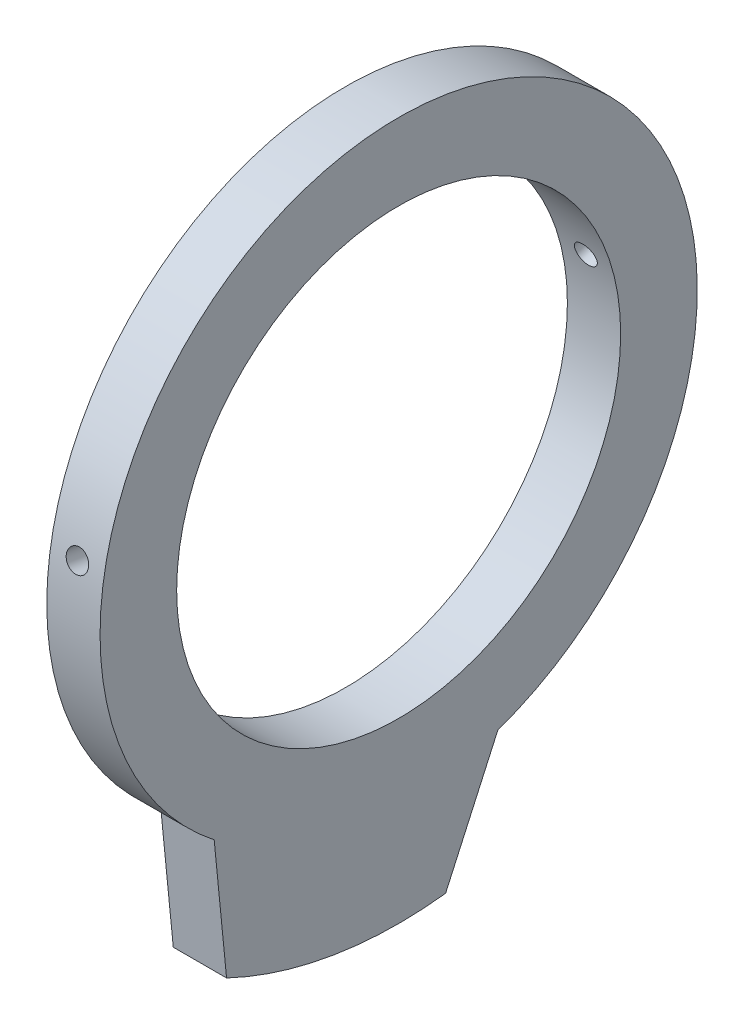
ISO-10303-21;
HEADER;
FILE_DESCRIPTION(('STEP AP214'),'2;1');
FILE_NAME('part.step','',(''),(''),'','','');
FILE_SCHEMA(('AUTOMOTIVE_DESIGN { 1 0 10303 214 1 1 1 1 }'));
ENDSEC;
DATA;
#1=APPLICATION_CONTEXT('core data for automotive mechanical design processes');
#2=APPLICATION_PROTOCOL_DEFINITION('international standard','automotive_design',2000,#1);
#3=PRODUCT_CONTEXT('',#1,'mechanical');
#4=PRODUCT('Part','Part','',(#3));
#5=PRODUCT_RELATED_PRODUCT_CATEGORY('part','',(#4));
#6=PRODUCT_DEFINITION_FORMATION('','',#4);
#7=PRODUCT_DEFINITION_CONTEXT('part definition',#1,'design');
#8=PRODUCT_DEFINITION('design','',#6,#7);
#9=PRODUCT_DEFINITION_SHAPE('','',#8);
#10=(LENGTH_UNIT() NAMED_UNIT(*) SI_UNIT(.MILLI.,.METRE.));
#11=(NAMED_UNIT(*) PLANE_ANGLE_UNIT() SI_UNIT($,.RADIAN.));
#12=(NAMED_UNIT(*) SI_UNIT($,.STERADIAN.) SOLID_ANGLE_UNIT());
#13=UNCERTAINTY_MEASURE_WITH_UNIT(LENGTH_MEASURE(1.E-05),#10,'distance_accuracy_value','');
#14=(GEOMETRIC_REPRESENTATION_CONTEXT(3) GLOBAL_UNCERTAINTY_ASSIGNED_CONTEXT((#13)) GLOBAL_UNIT_ASSIGNED_CONTEXT((#10,
#11,#12)) REPRESENTATION_CONTEXT('',''));
#15=CARTESIAN_POINT('',(0.,0.,0.));
#16=DIRECTION('',(0.,0.,1.));
#17=DIRECTION('',(1.,0.,0.));
#18=AXIS2_PLACEMENT_3D('',#15,#16,#17);
#19=CARTESIAN_POINT('',(12.,0.,0.));
#20=DIRECTION('',(-1.,0.,0.));
#21=DIRECTION('',(0.,0.,1.));
#22=AXIS2_PLACEMENT_3D('',#19,#20,#21);
#23=CYLINDRICAL_SURFACE('',#22,67.25);
#24=DIRECTION('',(-1.,0.,0.));
#25=VECTOR('',#24,1.);
#26=CARTESIAN_POINT('',(12.,-52.8792142824339,41.5493826292574));
#27=LINE('',#26,#25);
#28=CARTESIAN_POINT('',(12.,-52.8792142824339,41.5493826292574));
#29=VERTEX_POINT('',#28);
#30=CARTESIAN_POINT('',(0.,-52.8792142824339,41.5493826292574));
#31=VERTEX_POINT('',#30);
#32=EDGE_CURVE('E64',#29,#31,#27,.T.);
#33=ORIENTED_EDGE('',*,*,#32,.F.);
#34=CARTESIAN_POINT('',(12.,0.,0.));
#35=DIRECTION('',(1.,0.,0.));
#36=DIRECTION('',(0.,0.,-1.));
#37=AXIS2_PLACEMENT_3D('',#34,#35,#36);
#38=CIRCLE('',#37,67.25);
#39=CARTESIAN_POINT('',(12.,-63.4350909638531,-22.3282720873714));
#40=VERTEX_POINT('',#39);
#41=EDGE_CURVE('E11',#40,#29,#38,.T.);
#42=ORIENTED_EDGE('',*,*,#41,.F.);
#43=DIRECTION('',(-1.,0.,0.));
#44=VECTOR('',#43,1.);
#45=CARTESIAN_POINT('',(12.,-63.435090963853,-22.3282720873714));
#46=LINE('',#45,#44);
#47=CARTESIAN_POINT('',(0.,-63.435090963853,-22.3282720873714));
#48=VERTEX_POINT('',#47);
#49=EDGE_CURVE('E106',#40,#48,#46,.T.);
#50=ORIENTED_EDGE('',*,*,#49,.T.);
#51=CARTESIAN_POINT('',(0.,0.,0.));
#52=DIRECTION('',(1.,0.,0.));
#53=DIRECTION('',(0.,0.,-1.));
#54=AXIS2_PLACEMENT_3D('',#51,#52,#53);
#55=CIRCLE('',#54,67.25);
#56=EDGE_CURVE('E53',#48,#31,#55,.T.);
#57=ORIENTED_EDGE('',*,*,#56,.T.);
#58=EDGE_LOOP('',(#33,#42,#50,#57));
#59=FACE_BOUND('',#58,.T.);
#60=CARTESIAN_POINT('',(6.,13.4103499452431,65.8993551891528));
#61=CARTESIAN_POINT('',(5.85962596684936,13.410343921143,65.8993568182794));
#62=CARTESIAN_POINT('',(5.71915138417467,13.3987180678698,65.9017255594599));
#63=CARTESIAN_POINT('',(5.44207453378758,13.3524975738546,65.9111056134821));
#64=CARTESIAN_POINT('',(5.30547707444028,13.31787560917,65.9181224491555));
#65=CARTESIAN_POINT('',(5.04020848672856,13.2266352500863,65.9364904517764));
#66=CARTESIAN_POINT('',(4.91153346816741,13.1700277527785,65.9478394714366));
#67=CARTESIAN_POINT('',(4.66573141835666,13.036412016286,65.9743819874361));
#68=CARTESIAN_POINT('',(4.54860160557546,12.9594087075327,65.9895745546062));
#69=CARTESIAN_POINT('',(4.32910611098146,12.7870986184499,66.0231799825619));
#70=CARTESIAN_POINT('',(4.22674838246953,12.6917820421473,66.0415945663675));
#71=CARTESIAN_POINT('',(4.03976995925546,12.4855329511549,66.0808971212534));
#72=CARTESIAN_POINT('',(3.95514997617556,12.3745998102411,66.1017851915152));
#73=CARTESIAN_POINT('',(3.80603206393874,12.1401968005381,66.1452365031962));
#74=CARTESIAN_POINT('',(3.74153959555264,12.0167235415274,66.1678001971749));
#75=CARTESIAN_POINT('',(3.63454268673079,11.7607393906702,66.2137780397988));
#76=CARTESIAN_POINT('',(3.59203813459913,11.6282285447375,66.2371921841232));
#77=CARTESIAN_POINT('',(3.53024260001181,11.3579752633211,66.2840681272246));
#78=CARTESIAN_POINT('',(3.51094080233302,11.2202352961349,66.3075298986892));
#79=CARTESIAN_POINT('',(3.49606533820189,10.9433694127409,66.3537855866805));
#80=CARTESIAN_POINT('',(3.50049154933577,10.8042435036869,66.3765795066521));
#81=CARTESIAN_POINT('',(3.53293740149765,10.5286296092104,66.4208546731847));
#82=CARTESIAN_POINT('',(3.56094538440454,10.3921403544055,66.4423365627471));
#83=CARTESIAN_POINT('',(3.63974168616613,10.1256151405055,66.4834762406865));
#84=CARTESIAN_POINT('',(3.69053006886652,9.99557919949786,66.5031340239508));
#85=CARTESIAN_POINT('',(3.81345882697479,9.74563912678506,66.5402209360187));
#86=CARTESIAN_POINT('',(3.88560453591791,9.62573753554327,66.5576495065652));
#87=CARTESIAN_POINT('',(4.04919606179541,9.3995297669126,66.5899723425698));
#88=CARTESIAN_POINT('',(4.14064195062264,9.29322364016897,66.6048665985872));
#89=CARTESIAN_POINT('',(4.34030398385878,9.09719298450711,66.6319247782819));
#90=CARTESIAN_POINT('',(4.44853024216618,9.00747852773577,66.6440870444311));
#91=CARTESIAN_POINT('',(4.67864524147305,8.84729153214643,66.6655419631115));
#92=CARTESIAN_POINT('',(4.80053398506279,8.77681899697652,66.6748346150984));
#93=CARTESIAN_POINT('',(5.05451984979324,8.65714905306906,66.6904785590197));
#94=CARTESIAN_POINT('',(5.18661713585782,8.60795198813161,66.6968298034226));
#95=CARTESIAN_POINT('',(5.45726766953744,8.53226010230363,66.7065551968214));
#96=CARTESIAN_POINT('',(5.59582089024709,8.50576518680983,66.7099293582233));
#97=CARTESIAN_POINT('',(5.875361428989,8.47625571469535,66.7136853660637));
#98=CARTESIAN_POINT('',(6.01634724032873,8.47322711226874,66.7140690024875));
#99=CARTESIAN_POINT('',(6.29682893177522,8.49070119433891,66.7118472823151));
#100=CARTESIAN_POINT('',(6.43632481457059,8.51120383636555,66.7092419311136));
#101=CARTESIAN_POINT('',(6.70982730727681,8.57513621726688,66.7010537119806));
#102=CARTESIAN_POINT('',(6.84383543694115,8.61855956168,66.6954716744864));
#103=CARTESIAN_POINT('',(7.1026051330937,8.72707276875061,66.6813592935752));
#104=CARTESIAN_POINT('',(7.22736667041993,8.79216269973685,66.6728289408603));
#105=CARTESIAN_POINT('',(7.46416681211201,8.94216757861968,66.6528757434156));
#106=CARTESIAN_POINT('',(7.57619933037553,9.0270919511209,66.6414515234065));
#107=CARTESIAN_POINT('',(7.7843000809794,9.21430601667161,66.6158237008624));
#108=CARTESIAN_POINT('',(7.88036825414616,9.31659577408497,66.6016200880256));
#109=CARTESIAN_POINT('',(8.05386061579873,9.53566076915401,66.5706083352009));
#110=CARTESIAN_POINT('',(8.1312756758376,9.65244305697213,66.5537989265762));
#111=CARTESIAN_POINT('',(8.26520188617609,9.8971085163194,66.5178548291732));
#112=CARTESIAN_POINT('',(8.32171309686356,10.0249916557787,66.4987201471125));
#113=CARTESIAN_POINT('',(8.41221145555391,10.2881680619751,66.4585118573554));
#114=CARTESIAN_POINT('',(8.44620449453793,10.4234593806226,66.4374387584128));
#115=CARTESIAN_POINT('',(8.49072088023663,10.6976227179673,66.3938447970263));
#116=CARTESIAN_POINT('',(8.50124428117829,10.8364947283905,66.3713239379276));
#117=CARTESIAN_POINT('',(8.49852200901685,11.113782217989,66.3254557591832));
#118=CARTESIAN_POINT('',(8.48529069165981,11.2521979222836,66.3021089470457));
#119=CARTESIAN_POINT('',(8.43546415576133,11.5247346101806,66.2552799243878));
#120=CARTESIAN_POINT('',(8.39886889152243,11.6588555853824,66.2317977136027));
#121=CARTESIAN_POINT('',(8.30335572396551,11.9190180318254,66.1854741042815));
#122=CARTESIAN_POINT('',(8.24443749297158,12.045059384435,66.1626327151573));
#123=CARTESIAN_POINT('',(8.1059544828971,12.2855130231588,66.1184061616525));
#124=CARTESIAN_POINT('',(8.0263904163695,12.3999257104254,66.0970209470468));
#125=CARTESIAN_POINT('',(7.84882700631855,12.6139760393559,66.0565061314169));
#126=CARTESIAN_POINT('',(7.75081851631012,12.7136063064745,66.037377657187));
#127=CARTESIAN_POINT('',(7.53913826884652,12.8952603323604,66.0021465372339));
#128=CARTESIAN_POINT('',(7.42546264649562,12.977279733926,65.9860446404555));
#129=CARTESIAN_POINT('',(7.18561705687761,13.1214397606013,65.9575298176285));
#130=CARTESIAN_POINT('',(7.05943789041893,13.1835656051492,65.9451196349423));
#131=CARTESIAN_POINT('',(6.79832859520822,13.286060976545,65.9245465841147));
#132=CARTESIAN_POINT('',(6.6634090872376,13.3264563733602,65.9163786659845));
#133=CARTESIAN_POINT('',(6.43970122508831,13.3736927891832,65.9068066439632));
#134=CARTESIAN_POINT('',(6.35236403355643,13.3874221116735,65.9040174658687));
#135=CARTESIAN_POINT('',(6.17669784366073,13.4057525837661,65.9002912261015));
#136=CARTESIAN_POINT('',(6.08836884575234,13.4103537375597,65.8993541635782));
#137=CARTESIAN_POINT('',(6.,13.4103499452431,65.8993551891528));
#138=B_SPLINE_CURVE_WITH_KNOTS('',3,(#60,#61,#62,#63,#64,#65,#66,#67,#68,#69,#70,#71,#72,#73,
#74,#75,#76,#77,#78,#79,#80,#81,#82,#83,#84,#85,#86,#87,#88,#89,#90,#91,#92,#93,#94,#95,#96,#97,
#98,#99,#100,#101,#102,#103,#104,#105,#106,#107,#108,#109,#110,#111,#112,#113,#114,#115,#116,
#117,#118,#119,#120,#121,#122,#123,#124,#125,#126,#127,#128,#129,#130,#131,#132,#133,#134,#135,
#136,#137),.UNSPECIFIED.,.T.,.F.,(4,2,2,2,2,2,2,2,2,2,2,2,2,2,2,2,2,2,2,2,2,2,2,2,2,2,2,2,2,2,2,
2,2,2,2,2,2,2,4),(0.,0.420799534941201,0.842099959795231,1.26319183376372,1.68418200681227,
2.10539800237828,2.52663089351446,2.94797796966803,3.36932290540929,3.79047136841455,
4.21161765869935,4.63255586904702,5.0534952591483,5.47453985866155,5.89558602658648,
6.31688696195,6.73818797718827,7.15949580016905,7.58080186748813,8.00185574177114,
8.42290885612036,8.84384456629946,9.26478160397328,9.6859190640005,10.107058084985,
10.5284027859795,10.9497462697673,11.3709794822672,11.7922117214999,12.2131894821236,
12.6341680661387,13.0551528298827,13.4761230660459,13.8973026116886,14.3185862439213,
14.7401821600854,15.1612750518206,15.426178648559,15.6910821236623),.UNSPECIFIED.);
#139=CARTESIAN_POINT('',(6.,13.4103499452431,65.8993551891528));
#140=VERTEX_POINT('',#139);
#141=EDGE_CURVE('E128',#140,#140,#138,.T.);
#142=ORIENTED_EDGE('',*,*,#141,.F.);
#143=EDGE_LOOP('',(#142));
#144=FACE_BOUND('',#143,.T.);
#145=CARTESIAN_POINT('',(6.,15.6829256297998,-65.3957823081135));
#146=CARTESIAN_POINT('',(5.85962596684936,15.682931778207,-65.3957812399726));
#147=CARTESIAN_POINT('',(5.71915138417467,15.6944700212037,-65.3930171220917));
#148=CARTESIAN_POINT('',(5.44207453378758,15.7403264635433,-65.3819941380842));
#149=CARTESIAN_POINT('',(5.30547707444028,15.7746717621817,-65.3737287353155));
#150=CARTESIAN_POINT('',(5.04020848672857,15.8651307653616,-65.3518345491081));
#151=CARTESIAN_POINT('',(4.91153346816742,15.9212336857554,-65.3382084226595));
#152=CARTESIAN_POINT('',(4.66573141835666,16.0535546793141,-65.3058228570836));
#153=CARTESIAN_POINT('',(4.54860160557547,16.1297678910516,-65.2870646585341));
#154=CARTESIAN_POINT('',(4.32910611098147,16.3001448378741,-65.2447351466159));
#155=CARTESIAN_POINT('',(4.22674838246953,16.3943181798353,-65.2211612568509));
#156=CARTESIAN_POINT('',(4.03976995925547,16.5978639043325,-65.16965867056));
#157=CARTESIAN_POINT('',(3.95514997617556,16.7072368963721,-65.1417297993946));
#158=CARTESIAN_POINT('',(3.80603206393874,16.9380537491411,-65.0820945084803));
#159=CARTESIAN_POINT('',(3.74153959555264,17.0595008739247,-65.0503870667909));
#160=CARTESIAN_POINT('',(3.63454268673079,17.3109460446101,-64.9839252458606));
#161=CARTESIAN_POINT('',(3.59203813459913,17.4409440470707,-64.9491708820988));
#162=CARTESIAN_POINT('',(3.53024260001181,17.7057020674337,-64.8774953576048));
#163=CARTESIAN_POINT('',(3.51094080233301,17.8404598365468,-64.8405752148048));
#164=CARTESIAN_POINT('',(3.49606533820189,18.1109494682431,-64.7655441198916));
#165=CARTESIAN_POINT('',(3.50049154933577,18.2466813257975,-64.7274331739229));
#166=CARTESIAN_POINT('',(3.53293740149764,18.515199525869,-64.6511358251464));
#167=CARTESIAN_POINT('',(3.56094538440453,18.6479872905719,-64.6129494689238));
#168=CARTESIAN_POINT('',(3.63974168616612,18.9069430287309,-64.5376494794154));
#169=CARTESIAN_POINT('',(3.69053006886652,19.0331109836327,-64.5005358491363));
#170=CARTESIAN_POINT('',(3.81345882697479,19.2753220209821,-64.4285685483633));
#171=CARTESIAN_POINT('',(3.8856045359179,19.3913625649416,-64.3937154450411));
#172=CARTESIAN_POINT('',(4.0491960617954,19.6100502712417,-64.3274552954075));
#173=CARTESIAN_POINT('',(4.14064195062264,19.7126973836896,-64.2960482619334));
#174=CARTESIAN_POINT('',(4.34030398385878,19.9018087576694,-64.2377640335428));
#175=CARTESIAN_POINT('',(4.44853024216618,19.9882631896686,-64.2108895910489));
#176=CARTESIAN_POINT('',(4.67864524147305,20.1425190660065,-64.162668105104));
#177=CARTESIAN_POINT('',(4.80053398506279,20.2103205068088,-64.1413210627009));
#178=CARTESIAN_POINT('',(5.05451984979323,20.3253972035172,-64.1049482386296));
#179=CARTESIAN_POINT('',(5.18661713585781,20.3726721277259,-64.0899225591113));
#180=CARTESIAN_POINT('',(5.45726766953743,20.445387163748,-64.0667629305898));
#181=CARTESIAN_POINT('',(5.59582089024709,20.47082736655,-64.0586289528678));
#182=CARTESIAN_POINT('',(5.875361428989,20.4991612514313,-64.0495676335982));
#183=CARTESIAN_POINT('',(6.01634724032873,20.5020684207007,-64.0486359810859));
#184=CARTESIAN_POINT('',(6.29682893177521,20.4852914809004,-64.0540038368643));
#185=CARTESIAN_POINT('',(6.43632481457059,20.4656074126044,-64.0603033321039));
#186=CARTESIAN_POINT('',(6.70982730727681,20.4042004802652,-64.0798886562262));
#187=CARTESIAN_POINT('',(6.84383543694114,20.362483762931,-64.0931725365878));
#188=CARTESIAN_POINT('',(7.1026051330937,20.2581664537718,-64.1262205987629));
#189=CARTESIAN_POINT('',(7.22736667041992,20.1955657960864,-64.1459848010131));
#190=CARTESIAN_POINT('',(7.46416681211201,20.0511733107252,-64.191266187345));
#191=CARTESIAN_POINT('',(7.57619933037552,19.9693723596765,-64.2167861061352));
#192=CARTESIAN_POINT('',(7.78430008097939,19.7888565242283,-64.2726423929867));
#193=CARTESIAN_POINT('',(7.88036825414616,19.6901415771381,-64.3029787788999));
#194=CARTESIAN_POINT('',(8.05386061579872,19.4784818858979,-64.3674099513399));
#195=CARTESIAN_POINT('',(8.1312756758376,19.3655302156059,-64.4015065661952));
#196=CARTESIAN_POINT('',(8.26520188617608,19.1285828209449,-64.4722815426988));
#197=CARTESIAN_POINT('',(8.32171309686355,19.0045871284816,-64.5089598968885));
#198=CARTESIAN_POINT('',(8.4122114555539,18.7490601797932,-64.5836894481895));
#199=CARTESIAN_POINT('',(8.44620449453793,18.61753090422,-64.6217402834971));
#200=CARTESIAN_POINT('',(8.49072088023663,18.3506152441794,-64.6980423112452));
#201=CARTESIAN_POINT('',(8.50124428117829,18.2152288686247,-64.7362935032226));
#202=CARTESIAN_POINT('',(8.49852200901685,17.9445207916253,-64.8118539343783));
#203=CARTESIAN_POINT('',(8.48529069165981,17.8091991005214,-64.8491637286569));
#204=CARTESIAN_POINT('',(8.43546415576133,17.5423912334812,-64.9218463654998));
#205=CARTESIAN_POINT('',(8.39886889152243,17.4109050650474,-64.9572192042755));
#206=CARTESIAN_POINT('',(8.30335572396551,17.15552664677,-65.0251326697875));
#207=CARTESIAN_POINT('',(8.24443749297158,17.0316345084292,-65.0576732549409));
#208=CARTESIAN_POINT('',(8.1059544828971,16.7950059110703,-65.1191618500005));
#209=CARTESIAN_POINT('',(8.0263904163695,16.6822690672332,-65.1481099838426));
#210=CARTESIAN_POINT('',(7.84882700631855,16.4711402448578,-65.2018092758598));
#211=CARTESIAN_POINT('',(7.75081851631012,16.3727554265616,-65.2265583401115));
#212=CARTESIAN_POINT('',(7.53913826884652,16.1932224413122,-65.2713615112174));
#213=CARTESIAN_POINT('',(7.42546264649563,16.1120785400814,-65.2914144562897));
#214=CARTESIAN_POINT('',(7.18561705687762,15.9693670930506,-65.3264665788824));
#215=CARTESIAN_POINT('',(7.05943789041893,15.9078141031565,-65.3414619991896));
#216=CARTESIAN_POINT('',(6.79832859520823,15.8062221343819,-65.3661120186305));
#217=CARTESIAN_POINT('',(6.6634090872376,15.7661575738254,-65.3757729687828));
#218=CARTESIAN_POINT('',(6.43970122508831,15.7192992119933,-65.3870511118832));
#219=CARTESIAN_POINT('',(6.35236403355643,15.7056767897969,-65.3903227206602));
#220=CARTESIAN_POINT('',(6.17669784366073,15.6874880654939,-65.3946886544857));
#221=CARTESIAN_POINT('',(6.08836884575234,15.682921759229,-65.395782980534));
#222=CARTESIAN_POINT('',(6.,15.6829256297998,-65.3957823081135));
#223=B_SPLINE_CURVE_WITH_KNOTS('',3,(#145,#146,#147,#148,#149,#150,#151,#152,#153,#154,#155,
#156,#157,#158,#159,#160,#161,#162,#163,#164,#165,#166,#167,#168,#169,#170,#171,#172,#173,#174,
#175,#176,#177,#178,#179,#180,#181,#182,#183,#184,#185,#186,#187,#188,#189,#190,#191,#192,#193,
#194,#195,#196,#197,#198,#199,#200,#201,#202,#203,#204,#205,#206,#207,#208,#209,#210,#211,#212,
#213,#214,#215,#216,#217,#218,#219,#220,#221,#222),.UNSPECIFIED.,.T.,.F.,(4,2,2,2,2,2,2,2,2,2,2,
2,2,2,2,2,2,2,2,2,2,2,2,2,2,2,2,2,2,2,2,2,2,2,2,2,2,2,4),(0.,0.420799534941201,0.84209995979523,
1.26319183376372,1.68418200681226,2.10539800237827,2.52663089351446,2.94797796966802,
3.36932290540928,3.79047136841455,4.21161765869935,4.63255586904702,5.0534952591483,
5.47453985866155,5.89558602658648,6.31688696195,6.73818797718827,7.15949580016906,
7.58080186748813,8.00185574177115,8.42290885612036,8.84384456629946,9.26478160397328,
9.6859190640005,10.107058084985,10.5284027859795,10.9497462697673,11.3709794822672,
11.7922117214999,12.2131894821236,12.6341680661387,13.0551528298827,13.4761230660459,
13.8973026116886,14.3185862439213,14.7401821600854,15.1612750518206,15.426178648559,
15.6910821236623),.UNSPECIFIED.);
#224=CARTESIAN_POINT('',(6.,15.6829256297998,-65.3957823081135));
#225=VERTEX_POINT('',#224);
#226=EDGE_CURVE('E129',#225,#225,#223,.T.);
#227=ORIENTED_EDGE('',*,*,#226,.F.);
#228=EDGE_LOOP('',(#227));
#229=FACE_BOUND('',#228,.T.);
#230=ADVANCED_FACE('F39',(#59,#144,#229),#23,.T.);
#231=CARTESIAN_POINT('',(-1.2E-05,0.,0.));
#232=DIRECTION('',(1.,0.,0.));
#233=DIRECTION('',(0.,0.,-1.));
#234=AXIS2_PLACEMENT_3D('',#231,#232,#233);
#235=CYLINDRICAL_SURFACE('',#234,50.);
#236=CARTESIAN_POINT('',(12.,0.,0.));
#237=DIRECTION('',(1.,0.,0.));
#238=DIRECTION('',(0.,0.,-1.));
#239=AXIS2_PLACEMENT_3D('',#236,#237,#238);
#240=CIRCLE('',#239,50.);
#241=CARTESIAN_POINT('',(12.,0.,-50.));
#242=VERTEX_POINT('',#241);
#243=EDGE_CURVE('E121',#242,#242,#240,.T.);
#244=ORIENTED_EDGE('',*,*,#243,.T.);
#245=EDGE_LOOP('',(#244));
#246=FACE_BOUND('',#245,.T.);
#247=CARTESIAN_POINT('',(0.,0.,0.));
#248=DIRECTION('',(1.,0.,0.));
#249=DIRECTION('',(0.,0.,-1.));
#250=AXIS2_PLACEMENT_3D('',#247,#248,#249);
#251=CIRCLE('',#250,50.);
#252=CARTESIAN_POINT('',(0.,0.,-50.));
#253=VERTEX_POINT('',#252);
#254=EDGE_CURVE('E112',#253,#253,#251,.T.);
#255=ORIENTED_EDGE('',*,*,#254,.F.);
#256=EDGE_LOOP('',(#255));
#257=FACE_BOUND('',#256,.T.);
#258=CARTESIAN_POINT('',(6.,10.5986685058592,48.8637721211012));
#259=CARTESIAN_POINT('',(6.14033189749173,10.5986625319557,48.8637739585432));
#260=CARTESIAN_POINT('',(6.28076331454378,10.5870686087013,48.8662926336643));
#261=CARTESIAN_POINT('',(6.55775213079452,10.540974570761,48.8762558881767));
#262=CARTESIAN_POINT('',(6.69430476751412,10.5064474668436,48.8837062714817));
#263=CARTESIAN_POINT('',(6.95948347914927,10.4154542207504,48.903174391452));
#264=CARTESIAN_POINT('',(7.08811355615093,10.3589992625164,48.9151897997332));
#265=CARTESIAN_POINT('',(7.33383462246661,10.2257335101972,48.9432220854448));
#266=CARTESIAN_POINT('',(7.45092832660274,10.1489275210344,48.9592380182918));
#267=CARTESIAN_POINT('',(7.67040618696009,9.97700814066211,48.9945608549861));
#268=CARTESIAN_POINT('',(7.77277722061522,9.88187859183707,49.0138706616214));
#269=CARTESIAN_POINT('',(7.95979193099439,9.67599558517407,49.0549294620326));
#270=CARTESIAN_POINT('',(8.04443488411182,9.56524148989807,49.0766785553173));
#271=CARTESIAN_POINT('',(8.1936266739047,9.3311390422974,49.1217267411242));
#272=CARTESIAN_POINT('',(8.25816531981585,9.20778434472661,49.1450266124888));
#273=CARTESIAN_POINT('',(8.36525106549882,8.95198644411398,49.1922639994703));
#274=CARTESIAN_POINT('',(8.40779833169961,8.81954330986129,49.21620151026));
#275=CARTESIAN_POINT('',(8.46965897695554,8.54941854935492,49.2638429858897));
#276=CARTESIAN_POINT('',(8.48899194433319,8.41174144090907,49.2875471308677));
#277=CARTESIAN_POINT('',(8.50393565072239,8.1349448625622,49.333987902687));
#278=CARTESIAN_POINT('',(8.4995465764137,7.99582540402029,49.3567245371406));
#279=CARTESIAN_POINT('',(8.46718704663305,7.72022725404563,49.4005824778536));
#280=CARTESIAN_POINT('',(8.43923767582909,7.58374631301666,49.4217052100048));
#281=CARTESIAN_POINT('',(8.36058361707593,7.31718604222889,49.4618738865614));
#282=CARTESIAN_POINT('',(8.30987883372269,7.18710673931206,49.4809198222593));
#283=CARTESIAN_POINT('',(8.18712923312006,6.93700775376885,49.5166023174715));
#284=CARTESIAN_POINT('',(8.11507480927422,6.8169926309312,49.5332377873316));
#285=CARTESIAN_POINT('',(7.95167830607734,6.59052216414575,49.5638789569504));
#286=CARTESIAN_POINT('',(7.86033609051921,6.484066915964,49.5778846381366));
#287=CARTESIAN_POINT('',(7.6608376770977,6.28766424145602,49.6031764738836));
#288=CARTESIAN_POINT('',(7.55266318614111,6.19773501007499,49.614459635209));
#289=CARTESIAN_POINT('',(7.32263516427134,6.03712615608054,49.6342591084835));
#290=CARTESIAN_POINT('',(7.20078162972352,5.96644653858194,49.6427754196974));
#291=CARTESIAN_POINT('',(6.94684336835721,5.84638758188207,49.6570581654784));
#292=CARTESIAN_POINT('',(6.81475831119676,5.79700893075682,49.6628245112151));
#293=CARTESIAN_POINT('',(6.54411144308284,5.72099820499765,49.6716383486078));
#294=CARTESIAN_POINT('',(6.40554968084951,5.69436595928599,49.6746858607125));
#295=CARTESIAN_POINT('',(6.12604329250146,5.66464504649334,49.6780839494956));
#296=CARTESIAN_POINT('',(5.98510140859007,5.66153092132044,49.6784374424222));
#297=CARTESIAN_POINT('',(5.70469440805251,5.67887038793614,49.6764582506267));
#298=CARTESIAN_POINT('',(5.56522928654426,5.69932390178698,49.6741255747876));
#299=CARTESIAN_POINT('',(5.29180660709107,5.76318278159508,49.6667569486972));
#300=CARTESIAN_POINT('',(5.1578462915964,5.80657650114913,49.6617223701422));
#301=CARTESIAN_POINT('',(4.89915092229792,5.91504340750686,49.6489196917345));
#302=CARTESIAN_POINT('',(4.77441592188526,5.98011671976834,49.641151576063));
#303=CARTESIAN_POINT('',(4.53759420920132,6.13012066247967,49.6228507133499));
#304=CARTESIAN_POINT('',(4.42551846892419,6.21506832549103,49.6123155939974));
#305=CARTESIAN_POINT('',(4.21730706459619,6.40233736790615,49.5884962655016));
#306=CARTESIAN_POINT('',(4.12117150246224,6.5046588583847,49.5752120387824));
#307=CARTESIAN_POINT('',(3.94748338905203,6.72383125988227,49.5459615275104));
#308=CARTESIAN_POINT('',(3.86994736948848,6.84069495729488,49.5299928782592));
#309=CARTESIAN_POINT('',(3.7357723227154,7.08552404795327,49.4955615217276));
#310=CARTESIAN_POINT('',(3.67913320455518,7.21348939287775,49.4770988253027));
#311=CARTESIAN_POINT('',(3.58838864282293,7.47679243669891,49.4379941574433));
#312=CARTESIAN_POINT('',(3.55427262323868,7.61212664308934,49.4173532141213));
#313=CARTESIAN_POINT('',(3.50950805223142,7.88635300687461,49.3743323092088));
#314=CARTESIAN_POINT('',(3.49885936840168,8.02524514419052,49.3519523574309));
#315=CARTESIAN_POINT('',(3.50133301261623,8.30247546981757,49.306070831626));
#316=CARTESIAN_POINT('',(3.51442940869517,8.44081409727694,49.2825705084433));
#317=CARTESIAN_POINT('',(3.5639678491698,8.71317139457605,49.2351476022914));
#318=CARTESIAN_POINT('',(3.60040993754007,8.84719005627808,49.2112250185269));
#319=CARTESIAN_POINT('',(3.69560000254207,9.10713285603598,49.1637834376892));
#320=CARTESIAN_POINT('',(3.75434814303665,9.23305693462015,49.1402644435821));
#321=CARTESIAN_POINT('',(3.89247816000793,9.47328103187807,49.0945202301388));
#322=CARTESIAN_POINT('',(3.97185940308724,9.58758140722779,49.072294971113));
#323=CARTESIAN_POINT('',(4.14909507943065,9.80148608630015,49.0300192818546));
#324=CARTESIAN_POINT('',(4.24696758241241,9.90107584370107,49.0099710094138));
#325=CARTESIAN_POINT('',(4.45839579719041,10.0826789923045,48.9729333293993));
#326=CARTESIAN_POINT('',(4.57195536174113,10.1646880530088,48.9559446756388));
#327=CARTESIAN_POINT('',(4.81162351511208,10.308887084647,48.9257835534991));
#328=CARTESIAN_POINT('',(4.93774404409957,10.3710579573032,48.9126147636156));
#329=CARTESIAN_POINT('',(5.19877386148363,10.4736849229633,48.8907425118671));
#330=CARTESIAN_POINT('',(5.3336725562126,10.5141666651553,48.8820337761602));
#331=CARTESIAN_POINT('',(5.55784115281433,10.5616760437861,48.871784581554));
#332=CARTESIAN_POINT('',(5.64565906781374,10.5755308662571,48.8687859263765));
#333=CARTESIAN_POINT('',(5.82230468575662,10.5940289848862,48.8647791152069));
#334=CARTESIAN_POINT('',(5.91113238783476,10.5986722889374,48.8637709575091));
#335=CARTESIAN_POINT('',(6.,10.5986685058592,48.8637721211012));
#336=B_SPLINE_CURVE_WITH_KNOTS('',3,(#258,#259,#260,#261,#262,#263,#264,#265,#266,#267,#268,
#269,#270,#271,#272,#273,#274,#275,#276,#277,#278,#279,#280,#281,#282,#283,#284,#285,#286,#287,
#288,#289,#290,#291,#292,#293,#294,#295,#296,#297,#298,#299,#300,#301,#302,#303,#304,#305,#306,
#307,#308,#309,#310,#311,#312,#313,#314,#315,#316,#317,#318,#319,#320,#321,#322,#323,#324,#325,
#326,#327,#328,#329,#330,#331,#332,#333,#334,#335),.UNSPECIFIED.,.T.,.F.,(4,2,2,2,2,2,2,2,2,2,2,
2,2,2,2,2,2,2,2,2,2,2,2,2,2,2,2,2,2,2,2,2,2,2,2,2,2,2,4),(0.,0.420671291418144,0.84183853494344,
1.26279125051259,1.68364466665796,2.10487090218116,2.52611432753533,2.94757093274246,
3.36902434835373,3.79012188933977,4.21121611651849,4.63193389607312,5.05265343953963,
5.47356258041803,5.89447469378442,6.31584748560837,6.73722038939509,7.15860690359154,
7.57999024847465,8.00091738531719,8.42184313016535,8.84255538216972,9.26327006883921,
9.68434664249985,10.1054259082995,10.5268780639427,10.9483283852555,11.3695806680975,
11.7908305741558,12.2116207109099,12.6324116402781,13.0532056608848,13.4739867654326,
13.8951812055328,14.3164792758433,14.7381817157858,15.1593843508148,15.4257819829747,
15.692179386865),.UNSPECIFIED.);
#337=CARTESIAN_POINT('',(6.,10.5986685058592,48.8637721211012));
#338=VERTEX_POINT('',#337);
#339=EDGE_CURVE('E122',#338,#338,#336,.T.);
#340=ORIENTED_EDGE('',*,*,#339,.F.);
#341=EDGE_LOOP('',(#340));
#342=FACE_BOUND('',#341,.T.);
#343=CARTESIAN_POINT('',(6.,11.0350435757316,-48.7670771451571));
#344=CARTESIAN_POINT('',(6.14033189749173,11.0350497666399,-48.7670762870368));
#345=CARTESIAN_POINT('',(6.28076331454378,11.0466224053297,-48.7644615567355));
#346=CARTESIAN_POINT('',(6.55775213079452,11.0926105910973,-48.7540206016102));
#347=CARTESIAN_POINT('',(6.69430476751412,11.1270530528283,-48.7461882363082));
#348=CARTESIAN_POINT('',(6.95948347914927,11.2177527988661,-48.7253955789878));
#349=CARTESIAN_POINT('',(7.08811355615092,11.2739989625241,-48.7124379009893));
#350=CARTESIAN_POINT('',(7.33383462246661,11.4066320586703,-48.6815504991867));
#351=CARTESIAN_POINT('',(7.45092832660274,11.4830142369801,-48.6636219489699));
#352=CARTESIAN_POINT('',(7.67040618696009,11.653762535892,-48.623014134963));
#353=CARTESIAN_POINT('',(7.77277722061522,11.7481445279005,-48.6003306767507));
#354=CARTESIAN_POINT('',(7.95979193099439,11.9521003297944,-48.5505745877001));
#355=CARTESIAN_POINT('',(8.04443488411182,12.061674759486,-48.5235017777817));
#356=CARTESIAN_POINT('',(8.1936266739047,12.2928937550713,-48.4654408520432));
#357=CARTESIAN_POINT('',(8.25816531981585,12.41454440127,-48.4344507617267));
#358=CARTESIAN_POINT('',(8.36525106549882,12.6663528275454,-48.3692092630974));
#359=CARTESIAN_POINT('',(8.40779833169961,12.7965105432328,-48.3349578794683));
#360=CARTESIAN_POINT('',(8.46965897695554,13.0614754583514,-48.2640305208892));
#361=CARTESIAN_POINT('',(8.48899194433319,13.1962786389619,-48.2273566176821));
#362=CARTESIAN_POINT('',(8.50393565072239,13.4667836382628,-48.1525225584248));
#363=CARTESIAN_POINT('',(8.4995465764137,13.6024854498731,-48.1143624140728));
#364=CARTESIAN_POINT('',(8.46718704663304,13.8708131296854,-48.0376935450348));
#365=CARTESIAN_POINT('',(8.43923767582909,14.0034416392516,-47.9991851624679));
#366=CARTESIAN_POINT('',(8.36058361707593,14.2620189707529,-47.9229902533698));
#367=CARTESIAN_POINT('',(8.3098788337227,14.3879677646801,-47.885303730285));
#368=CARTESIAN_POINT('',(8.18712923312006,14.6297295691785,-47.8119963437543));
#369=CARTESIAN_POINT('',(8.11507480927422,14.745537986477,-47.7763764188523));
#370=CARTESIAN_POINT('',(7.95167830607734,14.9637534113201,-47.7084810437361));
#371=CARTESIAN_POINT('',(7.86033609051921,15.0661603242173,-47.6762056171426));
#372=CARTESIAN_POINT('',(7.6608376770977,15.254862733918,-47.6161632314264));
#373=CARTESIAN_POINT('',(7.5526631861411,15.3411404744825,-47.5884012453779));
#374=CARTESIAN_POINT('',(7.32263516427133,15.4950794079401,-47.5385010661268));
#375=CARTESIAN_POINT('',(7.20078162972352,15.5627405958866,-47.5163628744185));
#376=CARTESIAN_POINT('',(6.94684336835721,15.6775948780814,-47.4785919362195));
#377=CARTESIAN_POINT('',(6.81475831119676,15.7247873111365,-47.4629593998788));
#378=CARTESIAN_POINT('',(6.54411144308284,15.7974062715556,-47.4388388537061));
#379=CARTESIAN_POINT('',(6.40554968084951,15.8228329626217,-47.4303507901398));
#380=CARTESIAN_POINT('',(6.12604329250146,15.8512072997437,-47.4208757356551));
#381=CARTESIAN_POINT('',(5.98510140859007,15.854179252794,-47.4198806336962));
#382=CARTESIAN_POINT('',(5.70469440805251,15.8376267794602,-47.4254114500207));
#383=CARTESIAN_POINT('',(5.56522928654426,15.8181024274711,-47.4319373434323));
#384=CARTESIAN_POINT('',(5.29180660709107,15.7571083384364,-47.4522344930754));
#385=CARTESIAN_POINT('',(5.1578462915964,15.7156497370767,-47.4660020727921));
#386=CARTESIAN_POINT('',(4.89915092229792,15.6119276548512,-47.5002176833821));
#387=CARTESIAN_POINT('',(4.77441592188526,15.5496640535888,-47.5206657529147));
#388=CARTESIAN_POINT('',(4.53759420920132,15.4059704157937,-47.567444411106));
#389=CARTESIAN_POINT('',(4.42551846892419,15.3245239388986,-47.5937800446135));
#390=CARTESIAN_POINT('',(4.21730706459618,15.1447222384297,-47.6512987647448));
#391=CARTESIAN_POINT('',(4.12117150246224,15.0463669067536,-47.6824818823596));
#392=CARTESIAN_POINT('',(3.94748338905203,14.8353538676522,-47.7485548065955));
#393=CARTESIAN_POINT('',(3.86994736948848,14.7226835717842,-47.7834478712481));
#394=CARTESIAN_POINT('',(3.7357723227154,14.4862268926965,-47.8556631110527));
#395=CARTESIAN_POINT('',(3.67913320455518,14.3624405578607,-47.8929852756315));
#396=CARTESIAN_POINT('',(3.58838864282293,14.1072650306879,-47.9687686396764));
#397=CARTESIAN_POINT('',(3.55427262323868,13.9758794382474,-48.007229295672));
#398=CARTESIAN_POINT('',(3.50950805223142,13.7091487287581,-48.0840773631149));
#399=CARTESIAN_POINT('',(3.49885936840168,13.5738036340538,-48.1224647749742));
#400=CARTESIAN_POINT('',(3.50133301261622,13.303141731946,-48.1979889605365));
#401=CARTESIAN_POINT('',(3.51442940869517,13.1678250548975,-48.2351270535083));
#402=CARTESIAN_POINT('',(3.5639678491698,12.9009289111542,-48.3071956172165));
#403=CARTESIAN_POINT('',(3.60040993754007,12.7693494514996,-48.3421260837944));
#404=CARTESIAN_POINT('',(3.69560000254207,12.5136978528815,-48.4089334401439));
#405=CARTESIAN_POINT('',(3.75434814303664,12.389625769076,-48.4408103074811));
#406=CARTESIAN_POINT('',(3.89247816000793,12.152564118783,-48.5008263380669));
#407=CARTESIAN_POINT('',(3.97185940308724,12.0395742122401,-48.5289656160123));
#408=CARTESIAN_POINT('',(4.14909507943065,11.8278335567882,-48.5810073344706));
#409=CARTESIAN_POINT('',(4.24696758241241,11.7290969041072,-48.6049055859629));
#410=CARTESIAN_POINT('',(4.45839579719041,11.5488468850174,-48.6480498085387));
#411=CARTESIAN_POINT('',(4.57195536174113,11.4673377621838,-48.6672946335337));
#412=CARTESIAN_POINT('',(4.81162351511208,11.3238955117928,-48.7008710362129));
#413=CARTESIAN_POINT('',(4.93774404409957,11.2619812487259,-48.7151978803428));
#414=CARTESIAN_POINT('',(5.19877386148363,11.159721179605,-48.7387259006704));
#415=CARTESIAN_POINT('',(5.3336725562126,11.1193498974251,-48.7479331317233));
#416=CARTESIAN_POINT('',(5.55784115281434,11.0719580642168,-48.758712797447));
#417=CARTESIAN_POINT('',(5.64565906781375,11.0581333996938,-48.7618475525256));
#418=CARTESIAN_POINT('',(5.82230468575662,11.0396741991384,-48.7660299971962));
#419=CARTESIAN_POINT('',(5.91113238783476,11.0350396552313,-48.7670776885767));
#420=CARTESIAN_POINT('',(6.,11.0350435757316,-48.7670771451571));
#421=B_SPLINE_CURVE_WITH_KNOTS('',3,(#343,#344,#345,#346,#347,#348,#349,#350,#351,#352,#353,
#354,#355,#356,#357,#358,#359,#360,#361,#362,#363,#364,#365,#366,#367,#368,#369,#370,#371,#372,
#373,#374,#375,#376,#377,#378,#379,#380,#381,#382,#383,#384,#385,#386,#387,#388,#389,#390,#391,
#392,#393,#394,#395,#396,#397,#398,#399,#400,#401,#402,#403,#404,#405,#406,#407,#408,#409,#410,
#411,#412,#413,#414,#415,#416,#417,#418,#419,#420),.UNSPECIFIED.,.T.,.F.,(4,2,2,2,2,2,2,2,2,2,2,
2,2,2,2,2,2,2,2,2,2,2,2,2,2,2,2,2,2,2,2,2,2,2,2,2,2,2,4),(0.,0.420671291418143,
0.841838534943439,1.26279125051259,1.68364466665796,2.10487090218116,2.52611432753533,
2.94757093274246,3.36902434835373,3.79012188933977,4.21121611651849,4.63193389607313,
5.05265343953963,5.47356258041803,5.89447469378443,6.31584748560838,6.7372203893951,
7.15860690359155,7.57999024847465,8.00091738531719,8.42184313016536,8.84255538216973,
9.26327006883922,9.68434664249986,10.1054259082996,10.5268780639427,10.9483283852555,
11.3695806680975,11.7908305741558,12.21162071091,12.6324116402781,13.0532056608848,
13.4739867654327,13.8951812055328,14.3164792758433,14.7381817157858,15.1593843508148,
15.4257819829747,15.692179386865),.UNSPECIFIED.);
#422=CARTESIAN_POINT('',(6.,11.0350435757316,-48.7670771451571));
#423=VERTEX_POINT('',#422);
#424=EDGE_CURVE('E43',#423,#423,#421,.T.);
#425=ORIENTED_EDGE('',*,*,#424,.F.);
#426=EDGE_LOOP('',(#425));
#427=FACE_BOUND('',#426,.T.);
#428=ADVANCED_FACE('F130',(#246,#257,#342,#427),#235,.F.);
#429=CARTESIAN_POINT('',(12.,0.,0.));
#430=DIRECTION('',(1.,0.,0.));
#431=DIRECTION('',(0.,0.,-1.));
#432=AXIS2_PLACEMENT_3D('',#429,#430,#431);
#433=PLANE('',#432);
#434=ORIENTED_EDGE('',*,*,#243,.F.);
#435=EDGE_LOOP('',(#434));
#436=FACE_BOUND('',#435,.T.);
#437=ORIENTED_EDGE('',*,*,#41,.T.);
#438=DIRECTION('',(0.,-0.995188316653951,-0.0979806837875443));
#439=VECTOR('',#438,1.);
#440=CARTESIAN_POINT('',(12.,-52.8792142824339,41.5493826292574));
#441=LINE('',#440,#439);
#442=CARTESIAN_POINT('',(12.,-81.2267384609522,38.7584437122554));
#443=VERTEX_POINT('',#442);
#444=EDGE_CURVE('E83',#29,#443,#441,.T.);
#445=ORIENTED_EDGE('',*,*,#444,.T.);
#446=CARTESIAN_POINT('',(12.,0.,0.));
#447=DIRECTION('',(1.,0.,0.));
#448=DIRECTION('',(0.,0.,-1.));
#449=AXIS2_PLACEMENT_3D('',#446,#447,#448);
#450=CIRCLE('',#449,90.);
#451=CARTESIAN_POINT('',(12.,-89.3771901797871,-10.5696677131389));
#452=VERTEX_POINT('',#451);
#453=EDGE_CURVE('E87',#443,#452,#450,.T.);
#454=ORIENTED_EDGE('',*,*,#453,.T.);
#455=DIRECTION('',(0.,0.910805847414594,-0.412834964986475));
#456=VECTOR('',#455,1.);
#457=CARTESIAN_POINT('',(12.,-89.3771901797871,-10.5696677131389));
#458=LINE('',#457,#456);
#459=EDGE_CURVE('E104',#452,#40,#458,.T.);
#460=ORIENTED_EDGE('',*,*,#459,.T.);
#461=EDGE_LOOP('',(#437,#445,#454,#460));
#462=FACE_BOUND('',#461,.T.);
#463=ADVANCED_FACE('F85',(#436,#462),#433,.T.);
#464=CARTESIAN_POINT('',(0.,0.,0.));
#465=DIRECTION('',(1.,0.,0.));
#466=DIRECTION('',(0.,0.,-1.));
#467=AXIS2_PLACEMENT_3D('',#464,#465,#466);
#468=PLANE('',#467);
#469=ORIENTED_EDGE('',*,*,#254,.T.);
#470=EDGE_LOOP('',(#469));
#471=FACE_BOUND('',#470,.T.);
#472=ORIENTED_EDGE('',*,*,#56,.F.);
#473=DIRECTION('',(0.,0.910805847414594,-0.412834964986475));
#474=VECTOR('',#473,1.);
#475=CARTESIAN_POINT('',(0.,-89.3771901797871,-10.5696677131389));
#476=LINE('',#475,#474);
#477=CARTESIAN_POINT('',(0.,-89.3771901797871,-10.5696677131389));
#478=VERTEX_POINT('',#477);
#479=EDGE_CURVE('E90',#478,#48,#476,.T.);
#480=ORIENTED_EDGE('',*,*,#479,.F.);
#481=CARTESIAN_POINT('',(0.,0.,0.));
#482=DIRECTION('',(1.,0.,0.));
#483=DIRECTION('',(0.,0.,-1.));
#484=AXIS2_PLACEMENT_3D('',#481,#482,#483);
#485=CIRCLE('',#484,90.);
#486=CARTESIAN_POINT('',(0.,-81.2267384609522,38.7584437122554));
#487=VERTEX_POINT('',#486);
#488=EDGE_CURVE('E111',#487,#478,#485,.T.);
#489=ORIENTED_EDGE('',*,*,#488,.F.);
#490=DIRECTION('',(0.,-0.995188316653951,-0.0979806837875443));
#491=VECTOR('',#490,1.);
#492=CARTESIAN_POINT('',(0.,-52.8792142824339,41.5493826292574));
#493=LINE('',#492,#491);
#494=EDGE_CURVE('E96',#31,#487,#493,.T.);
#495=ORIENTED_EDGE('',*,*,#494,.F.);
#496=EDGE_LOOP('',(#472,#480,#489,#495));
#497=FACE_BOUND('',#496,.T.);
#498=ADVANCED_FACE('F156',(#471,#497),#468,.F.);
#499=CARTESIAN_POINT('',(12.,-52.8792142824339,41.5493826292574));
#500=DIRECTION('',(0.,0.0979806837875443,-0.995188316653951));
#501=DIRECTION('',(0.,0.995188316653951,0.0979806837875443));
#502=AXIS2_PLACEMENT_3D('',#499,#500,#501);
#503=PLANE('',#502);
#504=ORIENTED_EDGE('',*,*,#494,.T.);
#505=DIRECTION('',(-1.,0.,0.));
#506=VECTOR('',#505,1.);
#507=CARTESIAN_POINT('',(12.,-81.2267384609522,38.7584437122554));
#508=LINE('',#507,#506);
#509=EDGE_CURVE('E93',#443,#487,#508,.T.);
#510=ORIENTED_EDGE('',*,*,#509,.F.);
#511=ORIENTED_EDGE('',*,*,#444,.F.);
#512=ORIENTED_EDGE('',*,*,#32,.T.);
#513=EDGE_LOOP('',(#504,#510,#511,#512));
#514=FACE_BOUND('',#513,.T.);
#515=ADVANCED_FACE('F94',(#514),#503,.F.);
#516=CARTESIAN_POINT('',(12.,0.,0.));
#517=DIRECTION('',(-1.,0.,0.));
#518=DIRECTION('',(0.,0.,1.));
#519=AXIS2_PLACEMENT_3D('',#516,#517,#518);
#520=CYLINDRICAL_SURFACE('',#519,90.);
#521=ORIENTED_EDGE('',*,*,#488,.T.);
#522=DIRECTION('',(-1.,0.,0.));
#523=VECTOR('',#522,1.);
#524=CARTESIAN_POINT('',(12.,-89.3771901797871,-10.5696677131389));
#525=LINE('',#524,#523);
#526=EDGE_CURVE('E99',#452,#478,#525,.T.);
#527=ORIENTED_EDGE('',*,*,#526,.F.);
#528=ORIENTED_EDGE('',*,*,#453,.F.);
#529=ORIENTED_EDGE('',*,*,#509,.T.);
#530=EDGE_LOOP('',(#521,#527,#528,#529));
#531=FACE_BOUND('',#530,.T.);
#532=ADVANCED_FACE('F101',(#531),#520,.T.);
#533=CARTESIAN_POINT('',(12.,-89.3771901797871,-10.5696677131389));
#534=DIRECTION('',(0.,0.412834964986475,0.910805847414594));
#535=DIRECTION('',(0.,-0.910805847414594,0.412834964986475));
#536=AXIS2_PLACEMENT_3D('',#533,#534,#535);
#537=PLANE('',#536);
#538=ORIENTED_EDGE('',*,*,#479,.T.);
#539=ORIENTED_EDGE('',*,*,#49,.F.);
#540=ORIENTED_EDGE('',*,*,#459,.F.);
#541=ORIENTED_EDGE('',*,*,#526,.T.);
#542=EDGE_LOOP('',(#538,#539,#540,#541));
#543=FACE_BOUND('',#542,.T.);
#544=ADVANCED_FACE('F137',(#543),#537,.F.);
#545=CARTESIAN_POINT('',(6.,0.,0.));
#546=DIRECTION('',(0.,-0.162844465471912,-0.986651752172552));
#547=DIRECTION('',(0.,0.986651752172552,-0.162844465471912));
#548=AXIS2_PLACEMENT_3D('',#545,#546,#547);
#549=CYLINDRICAL_SURFACE('',#548,2.5);
#550=ORIENTED_EDGE('',*,*,#339,.T.);
#551=EDGE_LOOP('',(#550));
#552=FACE_BOUND('',#551,.T.);
#553=ORIENTED_EDGE('',*,*,#141,.T.);
#554=EDGE_LOOP('',(#553));
#555=FACE_BOUND('',#554,.T.);
#556=ADVANCED_FACE('F133',(#552,#555),#549,.F.);
#557=CARTESIAN_POINT('',(6.,0.,0.));
#558=DIRECTION('',(0.,-0.269191899931975,0.963086559459228));
#559=DIRECTION('',(0.,-0.963086559459228,-0.269191899931975));
#560=AXIS2_PLACEMENT_3D('',#557,#558,#559);
#561=CYLINDRICAL_SURFACE('',#560,2.5);
#562=ORIENTED_EDGE('',*,*,#424,.T.);
#563=EDGE_LOOP('',(#562));
#564=FACE_BOUND('',#563,.T.);
#565=ORIENTED_EDGE('',*,*,#226,.T.);
#566=EDGE_LOOP('',(#565));
#567=FACE_BOUND('',#566,.T.);
#568=ADVANCED_FACE('F136',(#564,#567),#561,.F.);
#569=CLOSED_SHELL('',(#230,#428,#463,#498,#515,#532,#544,#556,#568));
#570=MANIFOLD_SOLID_BREP('B2',#569);
#571=ADVANCED_BREP_SHAPE_REPRESENTATION('',(#18,#570),#14);
#572=SHAPE_DEFINITION_REPRESENTATION(#9,#571);
ENDSEC;
END-ISO-10303-21;
